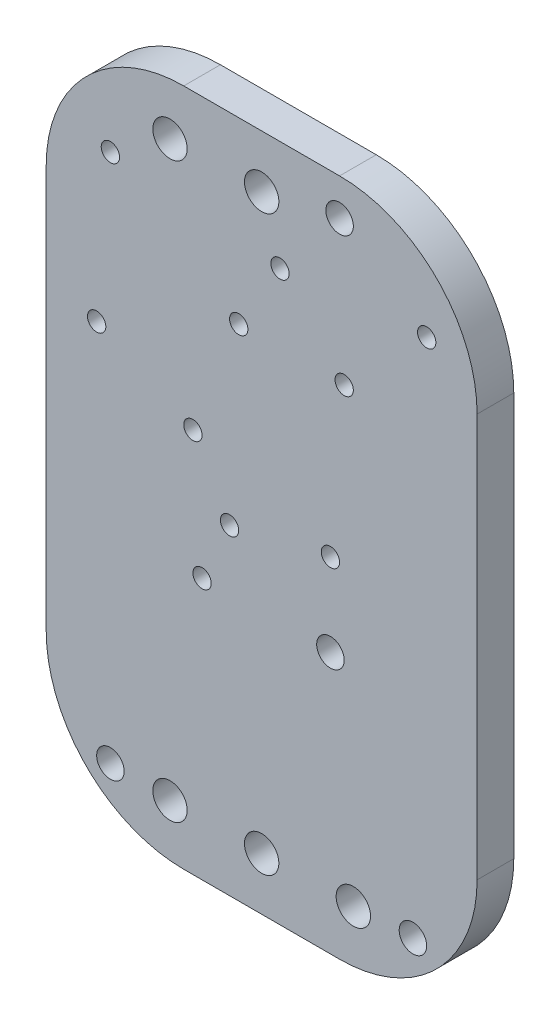
ISO-10303-21;
HEADER;
FILE_DESCRIPTION(('STEP AP214'),'2;1');
FILE_NAME('part.step','',(''),(''),'','','');
FILE_SCHEMA(('AUTOMOTIVE_DESIGN { 1 0 10303 214 1 1 1 1 }'));
ENDSEC;
DATA;
#1=APPLICATION_CONTEXT('core data for automotive mechanical design processes');
#2=APPLICATION_PROTOCOL_DEFINITION('international standard','automotive_design',2000,#1);
#3=PRODUCT_CONTEXT('',#1,'mechanical');
#4=PRODUCT('Part','Part','',(#3));
#5=PRODUCT_RELATED_PRODUCT_CATEGORY('part','',(#4));
#6=PRODUCT_DEFINITION_FORMATION('','',#4);
#7=PRODUCT_DEFINITION_CONTEXT('part definition',#1,'design');
#8=PRODUCT_DEFINITION('design','',#6,#7);
#9=PRODUCT_DEFINITION_SHAPE('','',#8);
#10=(LENGTH_UNIT() NAMED_UNIT(*) SI_UNIT(.MILLI.,.METRE.));
#11=(NAMED_UNIT(*) PLANE_ANGLE_UNIT() SI_UNIT($,.RADIAN.));
#12=(NAMED_UNIT(*) SI_UNIT($,.STERADIAN.) SOLID_ANGLE_UNIT());
#13=UNCERTAINTY_MEASURE_WITH_UNIT(LENGTH_MEASURE(1.E-05),#10,'distance_accuracy_value','');
#14=(GEOMETRIC_REPRESENTATION_CONTEXT(3) GLOBAL_UNCERTAINTY_ASSIGNED_CONTEXT((#13)) GLOBAL_UNIT_ASSIGNED_CONTEXT((#10,
#11,#12)) REPRESENTATION_CONTEXT('',''));
#15=CARTESIAN_POINT('',(0.,0.,0.));
#16=DIRECTION('',(0.,0.,1.));
#17=DIRECTION('',(1.,0.,0.));
#18=AXIS2_PLACEMENT_3D('',#15,#16,#17);
#19=CARTESIAN_POINT('',(3.3,11.9,0.8));
#20=DIRECTION('',(0.,0.,-1.));
#21=DIRECTION('',(-1.,0.,0.));
#22=AXIS2_PLACEMENT_3D('',#19,#20,#21);
#23=CYLINDRICAL_SURFACE('',#22,3.);
#24=CARTESIAN_POINT('',(3.3,11.9,0.));
#25=DIRECTION('',(0.,0.,1.));
#26=DIRECTION('',(1.,0.,0.));
#27=AXIS2_PLACEMENT_3D('',#24,#25,#26);
#28=CIRCLE('',#27,3.);
#29=CARTESIAN_POINT('',(3.3,14.9,0.));
#30=VERTEX_POINT('',#29);
#31=CARTESIAN_POINT('',(0.3,11.9,0.));
#32=VERTEX_POINT('',#31);
#33=EDGE_CURVE('E128',#30,#32,#28,.T.);
#34=ORIENTED_EDGE('',*,*,#33,.T.);
#35=DIRECTION('',(0.,0.,-1.));
#36=VECTOR('',#35,1.);
#37=CARTESIAN_POINT('',(0.3,11.9,0.8));
#38=LINE('',#37,#36);
#39=CARTESIAN_POINT('',(0.3,11.9,0.8));
#40=VERTEX_POINT('',#39);
#41=EDGE_CURVE('E11',#40,#32,#38,.T.);
#42=ORIENTED_EDGE('',*,*,#41,.F.);
#43=CARTESIAN_POINT('',(3.3,11.9,0.8));
#44=DIRECTION('',(0.,0.,1.));
#45=DIRECTION('',(1.,0.,0.));
#46=AXIS2_PLACEMENT_3D('',#43,#44,#45);
#47=CIRCLE('',#46,3.);
#48=CARTESIAN_POINT('',(3.3,14.9,0.8));
#49=VERTEX_POINT('',#48);
#50=EDGE_CURVE('E143',#49,#40,#47,.T.);
#51=ORIENTED_EDGE('',*,*,#50,.F.);
#52=DIRECTION('',(0.,0.,-1.));
#53=VECTOR('',#52,1.);
#54=CARTESIAN_POINT('',(3.3,14.9,0.8));
#55=LINE('',#54,#53);
#56=EDGE_CURVE('E124',#49,#30,#55,.T.);
#57=ORIENTED_EDGE('',*,*,#56,.T.);
#58=EDGE_LOOP('',(#34,#42,#51,#57));
#59=FACE_BOUND('',#58,.T.);
#60=ADVANCED_FACE('F32',(#59),#23,.T.);
#61=CARTESIAN_POINT('',(0.3,11.9,0.8));
#62=DIRECTION('',(1.,0.,0.));
#63=DIRECTION('',(0.,0.,-1.));
#64=AXIS2_PLACEMENT_3D('',#61,#62,#63);
#65=PLANE('',#64);
#66=DIRECTION('',(0.,-1.,0.));
#67=VECTOR('',#66,1.);
#68=CARTESIAN_POINT('',(0.3,11.9,0.));
#69=LINE('',#68,#67);
#70=CARTESIAN_POINT('',(0.3,3.1,0.));
#71=VERTEX_POINT('',#70);
#72=EDGE_CURVE('E131',#32,#71,#69,.T.);
#73=ORIENTED_EDGE('',*,*,#72,.T.);
#74=DIRECTION('',(0.,0.,-1.));
#75=VECTOR('',#74,1.);
#76=CARTESIAN_POINT('',(0.3,3.1,0.8));
#77=LINE('',#76,#75);
#78=CARTESIAN_POINT('',(0.3,3.1,0.8));
#79=VERTEX_POINT('',#78);
#80=EDGE_CURVE('E40',#79,#71,#77,.T.);
#81=ORIENTED_EDGE('',*,*,#80,.F.);
#82=DIRECTION('',(0.,-1.,0.));
#83=VECTOR('',#82,1.);
#84=CARTESIAN_POINT('',(0.3,11.9,0.8));
#85=LINE('',#84,#83);
#86=EDGE_CURVE('E91',#40,#79,#85,.T.);
#87=ORIENTED_EDGE('',*,*,#86,.F.);
#88=ORIENTED_EDGE('',*,*,#41,.T.);
#89=EDGE_LOOP('',(#73,#81,#87,#88));
#90=FACE_BOUND('',#89,.T.);
#91=ADVANCED_FACE('F345',(#90),#65,.F.);
#92=CARTESIAN_POINT('',(3.3,3.1,0.8));
#93=DIRECTION('',(0.,0.,-1.));
#94=DIRECTION('',(-1.,0.,0.));
#95=AXIS2_PLACEMENT_3D('',#92,#93,#94);
#96=CYLINDRICAL_SURFACE('',#95,3.);
#97=CARTESIAN_POINT('',(3.3,3.1,0.));
#98=DIRECTION('',(0.,0.,1.));
#99=DIRECTION('',(1.,0.,0.));
#100=AXIS2_PLACEMENT_3D('',#97,#98,#99);
#101=CIRCLE('',#100,3.);
#102=CARTESIAN_POINT('',(3.3,0.1,0.));
#103=VERTEX_POINT('',#102);
#104=EDGE_CURVE('E134',#71,#103,#101,.T.);
#105=ORIENTED_EDGE('',*,*,#104,.T.);
#106=DIRECTION('',(0.,0.,-1.));
#107=VECTOR('',#106,1.);
#108=CARTESIAN_POINT('',(3.3,0.1,0.8));
#109=LINE('',#108,#107);
#110=CARTESIAN_POINT('',(3.3,0.1,0.8));
#111=VERTEX_POINT('',#110);
#112=EDGE_CURVE('E150',#111,#103,#109,.T.);
#113=ORIENTED_EDGE('',*,*,#112,.F.);
#114=CARTESIAN_POINT('',(3.3,3.1,0.8));
#115=DIRECTION('',(0.,0.,1.));
#116=DIRECTION('',(1.,0.,0.));
#117=AXIS2_PLACEMENT_3D('',#114,#115,#116);
#118=CIRCLE('',#117,3.);
#119=EDGE_CURVE('E158',#79,#111,#118,.T.);
#120=ORIENTED_EDGE('',*,*,#119,.F.);
#121=ORIENTED_EDGE('',*,*,#80,.T.);
#122=EDGE_LOOP('',(#105,#113,#120,#121));
#123=FACE_BOUND('',#122,.T.);
#124=ADVANCED_FACE('F156',(#123),#96,.T.);
#125=CARTESIAN_POINT('',(3.3,0.1,0.8));
#126=DIRECTION('',(0.,1.,0.));
#127=DIRECTION('',(0.,0.,1.));
#128=AXIS2_PLACEMENT_3D('',#125,#126,#127);
#129=PLANE('',#128);
#130=DIRECTION('',(1.,0.,0.));
#131=VECTOR('',#130,1.);
#132=CARTESIAN_POINT('',(3.3,0.1,0.));
#133=LINE('',#132,#131);
#134=CARTESIAN_POINT('',(6.7,0.1,0.));
#135=VERTEX_POINT('',#134);
#136=EDGE_CURVE('E136',#103,#135,#133,.T.);
#137=ORIENTED_EDGE('',*,*,#136,.T.);
#138=DIRECTION('',(0.,0.,-1.));
#139=VECTOR('',#138,1.);
#140=CARTESIAN_POINT('',(6.7,0.1,0.8));
#141=LINE('',#140,#139);
#142=CARTESIAN_POINT('',(6.7,0.1,0.8));
#143=VERTEX_POINT('',#142);
#144=EDGE_CURVE('E147',#143,#135,#141,.T.);
#145=ORIENTED_EDGE('',*,*,#144,.F.);
#146=DIRECTION('',(1.,0.,0.));
#147=VECTOR('',#146,1.);
#148=CARTESIAN_POINT('',(3.3,0.1,0.8));
#149=LINE('',#148,#147);
#150=EDGE_CURVE('E170',#111,#143,#149,.T.);
#151=ORIENTED_EDGE('',*,*,#150,.F.);
#152=ORIENTED_EDGE('',*,*,#112,.T.);
#153=EDGE_LOOP('',(#137,#145,#151,#152));
#154=FACE_BOUND('',#153,.T.);
#155=ADVANCED_FACE('F166',(#154),#129,.F.);
#156=CARTESIAN_POINT('',(6.7,3.1,0.8));
#157=DIRECTION('',(0.,0.,-1.));
#158=DIRECTION('',(-1.,0.,0.));
#159=AXIS2_PLACEMENT_3D('',#156,#157,#158);
#160=CYLINDRICAL_SURFACE('',#159,3.);
#161=CARTESIAN_POINT('',(6.7,3.1,0.));
#162=DIRECTION('',(0.,0.,1.));
#163=DIRECTION('',(1.,0.,0.));
#164=AXIS2_PLACEMENT_3D('',#161,#162,#163);
#165=CIRCLE('',#164,3.);
#166=CARTESIAN_POINT('',(9.7,3.1,0.));
#167=VERTEX_POINT('',#166);
#168=EDGE_CURVE('E138',#135,#167,#165,.T.);
#169=ORIENTED_EDGE('',*,*,#168,.T.);
#170=DIRECTION('',(0.,0.,-1.));
#171=VECTOR('',#170,1.);
#172=CARTESIAN_POINT('',(9.7,3.1,0.8));
#173=LINE('',#172,#171);
#174=CARTESIAN_POINT('',(9.7,3.1,0.8));
#175=VERTEX_POINT('',#174);
#176=EDGE_CURVE('E119',#175,#167,#173,.T.);
#177=ORIENTED_EDGE('',*,*,#176,.F.);
#178=CARTESIAN_POINT('',(6.7,3.1,0.8));
#179=DIRECTION('',(0.,0.,1.));
#180=DIRECTION('',(1.,0.,0.));
#181=AXIS2_PLACEMENT_3D('',#178,#179,#180);
#182=CIRCLE('',#181,3.);
#183=EDGE_CURVE('E110',#143,#175,#182,.T.);
#184=ORIENTED_EDGE('',*,*,#183,.F.);
#185=ORIENTED_EDGE('',*,*,#144,.T.);
#186=EDGE_LOOP('',(#169,#177,#184,#185));
#187=FACE_BOUND('',#186,.T.);
#188=ADVANCED_FACE('F169',(#187),#160,.T.);
#189=CARTESIAN_POINT('',(9.7,3.1,0.8));
#190=DIRECTION('',(-1.,0.,0.));
#191=DIRECTION('',(0.,0.,1.));
#192=AXIS2_PLACEMENT_3D('',#189,#190,#191);
#193=PLANE('',#192);
#194=DIRECTION('',(0.,1.,0.));
#195=VECTOR('',#194,1.);
#196=CARTESIAN_POINT('',(9.7,3.1,0.));
#197=LINE('',#196,#195);
#198=CARTESIAN_POINT('',(9.7,11.9,0.));
#199=VERTEX_POINT('',#198);
#200=EDGE_CURVE('E118',#167,#199,#197,.T.);
#201=ORIENTED_EDGE('',*,*,#200,.T.);
#202=DIRECTION('',(0.,0.,-1.));
#203=VECTOR('',#202,1.);
#204=CARTESIAN_POINT('',(9.7,11.9,0.8));
#205=LINE('',#204,#203);
#206=CARTESIAN_POINT('',(9.7,11.9,0.8));
#207=VERTEX_POINT('',#206);
#208=EDGE_CURVE('E115',#207,#199,#205,.T.);
#209=ORIENTED_EDGE('',*,*,#208,.F.);
#210=DIRECTION('',(0.,1.,0.));
#211=VECTOR('',#210,1.);
#212=CARTESIAN_POINT('',(9.7,3.1,0.8));
#213=LINE('',#212,#211);
#214=EDGE_CURVE('E104',#175,#207,#213,.T.);
#215=ORIENTED_EDGE('',*,*,#214,.F.);
#216=ORIENTED_EDGE('',*,*,#176,.T.);
#217=EDGE_LOOP('',(#201,#209,#215,#216));
#218=FACE_BOUND('',#217,.T.);
#219=ADVANCED_FACE('F116',(#218),#193,.F.);
#220=CARTESIAN_POINT('',(6.7,11.9,0.8));
#221=DIRECTION('',(0.,0.,-1.));
#222=DIRECTION('',(-1.,0.,0.));
#223=AXIS2_PLACEMENT_3D('',#220,#221,#222);
#224=CYLINDRICAL_SURFACE('',#223,3.);
#225=CARTESIAN_POINT('',(6.7,11.9,0.));
#226=DIRECTION('',(0.,0.,1.));
#227=DIRECTION('',(1.,0.,0.));
#228=AXIS2_PLACEMENT_3D('',#225,#226,#227);
#229=CIRCLE('',#228,3.);
#230=CARTESIAN_POINT('',(6.7,14.9,0.));
#231=VERTEX_POINT('',#230);
#232=EDGE_CURVE('E77',#199,#231,#229,.T.);
#233=ORIENTED_EDGE('',*,*,#232,.T.);
#234=DIRECTION('',(0.,0.,-1.));
#235=VECTOR('',#234,1.);
#236=CARTESIAN_POINT('',(6.7,14.9,0.8));
#237=LINE('',#236,#235);
#238=CARTESIAN_POINT('',(6.7,14.9,0.8));
#239=VERTEX_POINT('',#238);
#240=EDGE_CURVE('E120',#239,#231,#237,.T.);
#241=ORIENTED_EDGE('',*,*,#240,.F.);
#242=CARTESIAN_POINT('',(6.7,11.9,0.8));
#243=DIRECTION('',(0.,0.,1.));
#244=DIRECTION('',(1.,0.,0.));
#245=AXIS2_PLACEMENT_3D('',#242,#243,#244);
#246=CIRCLE('',#245,3.);
#247=EDGE_CURVE('E108',#207,#239,#246,.T.);
#248=ORIENTED_EDGE('',*,*,#247,.F.);
#249=ORIENTED_EDGE('',*,*,#208,.T.);
#250=EDGE_LOOP('',(#233,#241,#248,#249));
#251=FACE_BOUND('',#250,.T.);
#252=ADVANCED_FACE('F122',(#251),#224,.T.);
#253=CARTESIAN_POINT('',(6.7,14.9,0.8));
#254=DIRECTION('',(0.,-1.,0.));
#255=DIRECTION('',(0.,0.,-1.));
#256=AXIS2_PLACEMENT_3D('',#253,#254,#255);
#257=PLANE('',#256);
#258=DIRECTION('',(-1.,0.,0.));
#259=VECTOR('',#258,1.);
#260=CARTESIAN_POINT('',(6.7,14.9,0.));
#261=LINE('',#260,#259);
#262=EDGE_CURVE('E83',#231,#30,#261,.T.);
#263=ORIENTED_EDGE('',*,*,#262,.T.);
#264=ORIENTED_EDGE('',*,*,#56,.F.);
#265=DIRECTION('',(-1.,0.,0.));
#266=VECTOR('',#265,1.);
#267=CARTESIAN_POINT('',(6.7,14.9,0.8));
#268=LINE('',#267,#266);
#269=EDGE_CURVE('E48',#239,#49,#268,.T.);
#270=ORIENTED_EDGE('',*,*,#269,.F.);
#271=ORIENTED_EDGE('',*,*,#240,.T.);
#272=EDGE_LOOP('',(#263,#264,#270,#271));
#273=FACE_BOUND('',#272,.T.);
#274=ADVANCED_FACE('F295',(#273),#257,.F.);
#275=CARTESIAN_POINT('',(3.3,11.9,0.8));
#276=DIRECTION('',(0.,0.,1.));
#277=DIRECTION('',(1.,0.,0.));
#278=AXIS2_PLACEMENT_3D('',#275,#276,#277);
#279=PLANE('',#278);
#280=CARTESIAN_POINT('',(6.8,11.,0.8));
#281=DIRECTION('',(0.,0.,1.));
#282=DIRECTION('',(1.,0.,0.));
#283=AXIS2_PLACEMENT_3D('',#280,#281,#282);
#284=CIRCLE('',#283,0.2);
#285=CARTESIAN_POINT('',(7.,11.,0.8));
#286=VERTEX_POINT('',#285);
#287=EDGE_CURVE('E246',#286,#286,#284,.T.);
#288=ORIENTED_EDGE('',*,*,#287,.F.);
#289=EDGE_LOOP('',(#288));
#290=FACE_BOUND('',#289,.T.);
#291=CARTESIAN_POINT('',(6.5,7.6,0.8));
#292=DIRECTION('',(0.,0.,1.));
#293=DIRECTION('',(1.,0.,0.));
#294=AXIS2_PLACEMENT_3D('',#291,#292,#293);
#295=CIRCLE('',#294,0.2);
#296=CARTESIAN_POINT('',(6.7,7.6,0.8));
#297=VERTEX_POINT('',#296);
#298=EDGE_CURVE('E263',#297,#297,#295,.T.);
#299=ORIENTED_EDGE('',*,*,#298,.F.);
#300=EDGE_LOOP('',(#299));
#301=FACE_BOUND('',#300,.T.);
#302=CARTESIAN_POINT('',(6.5,5.8,0.8));
#303=DIRECTION('',(0.,0.,1.));
#304=DIRECTION('',(1.,0.,0.));
#305=AXIS2_PLACEMENT_3D('',#302,#303,#304);
#306=CIRCLE('',#305,0.3);
#307=CARTESIAN_POINT('',(6.8,5.8,0.8));
#308=VERTEX_POINT('',#307);
#309=EDGE_CURVE('E264',#308,#308,#306,.T.);
#310=ORIENTED_EDGE('',*,*,#309,.F.);
#311=EDGE_LOOP('',(#310));
#312=FACE_BOUND('',#311,.T.);
#313=CARTESIAN_POINT('',(4.3,7.1,0.8));
#314=DIRECTION('',(0.,0.,1.));
#315=DIRECTION('',(1.,0.,0.));
#316=AXIS2_PLACEMENT_3D('',#313,#314,#315);
#317=CIRCLE('',#316,0.2);
#318=CARTESIAN_POINT('',(4.5,7.1,0.8));
#319=VERTEX_POINT('',#318);
#320=EDGE_CURVE('E281',#319,#319,#317,.T.);
#321=ORIENTED_EDGE('',*,*,#320,.F.);
#322=EDGE_LOOP('',(#321));
#323=FACE_BOUND('',#322,.T.);
#324=CARTESIAN_POINT('',(5.4,12.5,0.8));
#325=DIRECTION('',(0.,0.,1.));
#326=DIRECTION('',(1.,0.,0.));
#327=AXIS2_PLACEMENT_3D('',#324,#325,#326);
#328=CIRCLE('',#327,0.2);
#329=CARTESIAN_POINT('',(5.6,12.5,0.8));
#330=VERTEX_POINT('',#329);
#331=EDGE_CURVE('E275',#330,#330,#328,.T.);
#332=ORIENTED_EDGE('',*,*,#331,.F.);
#333=EDGE_LOOP('',(#332));
#334=FACE_BOUND('',#333,.T.);
#335=CARTESIAN_POINT('',(1.4,9.5,0.8));
#336=DIRECTION('',(0.,0.,1.));
#337=DIRECTION('',(1.,0.,0.));
#338=AXIS2_PLACEMENT_3D('',#335,#336,#337);
#339=CIRCLE('',#338,0.2);
#340=CARTESIAN_POINT('',(1.6,9.5,0.8));
#341=VERTEX_POINT('',#340);
#342=EDGE_CURVE('E227',#341,#341,#339,.T.);
#343=ORIENTED_EDGE('',*,*,#342,.F.);
#344=EDGE_LOOP('',(#343));
#345=FACE_BOUND('',#344,.T.);
#346=CARTESIAN_POINT('',(8.6,12.8,0.8));
#347=DIRECTION('',(0.,0.,1.));
#348=DIRECTION('',(1.,0.,0.));
#349=AXIS2_PLACEMENT_3D('',#346,#347,#348);
#350=CIRCLE('',#349,0.200000000000001);
#351=CARTESIAN_POINT('',(8.8,12.8,0.8));
#352=VERTEX_POINT('',#351);
#353=EDGE_CURVE('E233',#352,#352,#350,.T.);
#354=ORIENTED_EDGE('',*,*,#353,.F.);
#355=EDGE_LOOP('',(#354));
#356=FACE_BOUND('',#355,.T.);
#357=CARTESIAN_POINT('',(1.7,12.85,0.8));
#358=DIRECTION('',(0.,0.,1.));
#359=DIRECTION('',(1.,0.,0.));
#360=AXIS2_PLACEMENT_3D('',#357,#358,#359);
#361=CIRCLE('',#360,0.2);
#362=CARTESIAN_POINT('',(1.9,12.85,0.8));
#363=VERTEX_POINT('',#362);
#364=EDGE_CURVE('E234',#363,#363,#361,.T.);
#365=ORIENTED_EDGE('',*,*,#364,.F.);
#366=EDGE_LOOP('',(#365));
#367=FACE_BOUND('',#366,.T.);
#368=CARTESIAN_POINT('',(3.5,8.5,0.8));
#369=DIRECTION('',(0.,0.,1.));
#370=DIRECTION('',(1.,0.,0.));
#371=AXIS2_PLACEMENT_3D('',#368,#369,#370);
#372=CIRCLE('',#371,0.2);
#373=CARTESIAN_POINT('',(3.7,8.5,0.8));
#374=VERTEX_POINT('',#373);
#375=EDGE_CURVE('E252',#374,#374,#372,.T.);
#376=ORIENTED_EDGE('',*,*,#375,.F.);
#377=EDGE_LOOP('',(#376));
#378=FACE_BOUND('',#377,.T.);
#379=CARTESIAN_POINT('',(3.7,5.8,0.8));
#380=DIRECTION('',(0.,0.,1.));
#381=DIRECTION('',(1.,0.,0.));
#382=AXIS2_PLACEMENT_3D('',#379,#380,#381);
#383=CIRCLE('',#382,0.2);
#384=CARTESIAN_POINT('',(3.9,5.8,0.8));
#385=VERTEX_POINT('',#384);
#386=EDGE_CURVE('E245',#385,#385,#383,.T.);
#387=ORIENTED_EDGE('',*,*,#386,.F.);
#388=EDGE_LOOP('',(#387));
#389=FACE_BOUND('',#388,.T.);
#390=CARTESIAN_POINT('',(4.5,11.,0.8));
#391=DIRECTION('',(0.,0.,1.));
#392=DIRECTION('',(1.,0.,0.));
#393=AXIS2_PLACEMENT_3D('',#390,#391,#392);
#394=CIRCLE('',#393,0.2);
#395=CARTESIAN_POINT('',(4.7,11.,0.8));
#396=VERTEX_POINT('',#395);
#397=EDGE_CURVE('E204',#396,#396,#394,.T.);
#398=ORIENTED_EDGE('',*,*,#397,.F.);
#399=EDGE_LOOP('',(#398));
#400=FACE_BOUND('',#399,.T.);
#401=CARTESIAN_POINT('',(7.,1.25,0.8));
#402=DIRECTION('',(0.,0.,1.));
#403=DIRECTION('',(1.,0.,0.));
#404=AXIS2_PLACEMENT_3D('',#401,#402,#403);
#405=CIRCLE('',#404,0.375);
#406=CARTESIAN_POINT('',(7.375,1.25,0.8));
#407=VERTEX_POINT('',#406);
#408=EDGE_CURVE('E203',#407,#407,#405,.T.);
#409=ORIENTED_EDGE('',*,*,#408,.F.);
#410=EDGE_LOOP('',(#409));
#411=FACE_BOUND('',#410,.T.);
#412=CARTESIAN_POINT('',(5.,1.25,0.8));
#413=DIRECTION('',(0.,0.,1.));
#414=DIRECTION('',(1.,0.,0.));
#415=AXIS2_PLACEMENT_3D('',#412,#413,#414);
#416=CIRCLE('',#415,0.375);
#417=CARTESIAN_POINT('',(5.375,1.25,0.8));
#418=VERTEX_POINT('',#417);
#419=EDGE_CURVE('E210',#418,#418,#416,.T.);
#420=ORIENTED_EDGE('',*,*,#419,.F.);
#421=EDGE_LOOP('',(#420));
#422=FACE_BOUND('',#421,.T.);
#423=CARTESIAN_POINT('',(3.,1.25,0.8));
#424=DIRECTION('',(0.,0.,1.));
#425=DIRECTION('',(1.,0.,0.));
#426=AXIS2_PLACEMENT_3D('',#423,#424,#425);
#427=CIRCLE('',#426,0.375);
#428=CARTESIAN_POINT('',(3.375,1.25,0.8));
#429=VERTEX_POINT('',#428);
#430=EDGE_CURVE('E216',#429,#429,#427,.T.);
#431=ORIENTED_EDGE('',*,*,#430,.F.);
#432=EDGE_LOOP('',(#431));
#433=FACE_BOUND('',#432,.T.);
#434=CARTESIAN_POINT('',(3.,13.75,0.8));
#435=DIRECTION('',(0.,0.,1.));
#436=DIRECTION('',(1.,0.,0.));
#437=AXIS2_PLACEMENT_3D('',#434,#435,#436);
#438=CIRCLE('',#437,0.375);
#439=CARTESIAN_POINT('',(3.375,13.75,0.8));
#440=VERTEX_POINT('',#439);
#441=EDGE_CURVE('E186',#440,#440,#438,.T.);
#442=ORIENTED_EDGE('',*,*,#441,.F.);
#443=EDGE_LOOP('',(#442));
#444=FACE_BOUND('',#443,.T.);
#445=CARTESIAN_POINT('',(5.,13.75,0.8));
#446=DIRECTION('',(0.,0.,1.));
#447=DIRECTION('',(1.,0.,0.));
#448=AXIS2_PLACEMENT_3D('',#445,#446,#447);
#449=CIRCLE('',#448,0.375);
#450=CARTESIAN_POINT('',(5.375,13.75,0.8));
#451=VERTEX_POINT('',#450);
#452=EDGE_CURVE('E185',#451,#451,#449,.T.);
#453=ORIENTED_EDGE('',*,*,#452,.F.);
#454=EDGE_LOOP('',(#453));
#455=FACE_BOUND('',#454,.T.);
#456=CARTESIAN_POINT('',(6.7,14.1,0.8));
#457=DIRECTION('',(0.,0.,1.));
#458=DIRECTION('',(1.,0.,0.));
#459=AXIS2_PLACEMENT_3D('',#456,#457,#458);
#460=CIRCLE('',#459,0.3);
#461=CARTESIAN_POINT('',(7.,14.1,0.8));
#462=VERTEX_POINT('',#461);
#463=EDGE_CURVE('E192',#462,#462,#460,.T.);
#464=ORIENTED_EDGE('',*,*,#463,.F.);
#465=EDGE_LOOP('',(#464));
#466=FACE_BOUND('',#465,.T.);
#467=CARTESIAN_POINT('',(8.3,1.3,0.8));
#468=DIRECTION('',(0.,0.,1.));
#469=DIRECTION('',(1.,0.,0.));
#470=AXIS2_PLACEMENT_3D('',#467,#468,#469);
#471=CIRCLE('',#470,0.3);
#472=CARTESIAN_POINT('',(8.6,1.3,0.8));
#473=VERTEX_POINT('',#472);
#474=EDGE_CURVE('E179',#473,#473,#471,.T.);
#475=ORIENTED_EDGE('',*,*,#474,.F.);
#476=EDGE_LOOP('',(#475));
#477=FACE_BOUND('',#476,.T.);
#478=CARTESIAN_POINT('',(1.7,1.3,0.8));
#479=DIRECTION('',(0.,0.,1.));
#480=DIRECTION('',(1.,0.,0.));
#481=AXIS2_PLACEMENT_3D('',#478,#479,#480);
#482=CIRCLE('',#481,0.3);
#483=CARTESIAN_POINT('',(2.,1.3,0.8));
#484=VERTEX_POINT('',#483);
#485=EDGE_CURVE('E132',#484,#484,#482,.T.);
#486=ORIENTED_EDGE('',*,*,#485,.F.);
#487=EDGE_LOOP('',(#486));
#488=FACE_BOUND('',#487,.T.);
#489=ORIENTED_EDGE('',*,*,#50,.T.);
#490=ORIENTED_EDGE('',*,*,#86,.T.);
#491=ORIENTED_EDGE('',*,*,#119,.T.);
#492=ORIENTED_EDGE('',*,*,#150,.T.);
#493=ORIENTED_EDGE('',*,*,#183,.T.);
#494=ORIENTED_EDGE('',*,*,#214,.T.);
#495=ORIENTED_EDGE('',*,*,#247,.T.);
#496=ORIENTED_EDGE('',*,*,#269,.T.);
#497=EDGE_LOOP('',(#489,#490,#491,#492,#493,#494,#495,#496));
#498=FACE_BOUND('',#497,.T.);
#499=ADVANCED_FACE('F106',(#290,#301,#312,#323,#334,#345,#356,#367,#378,#389,#400,#411,#422,
#433,#444,#455,#466,#477,#488,#498),#279,.T.);
#500=CARTESIAN_POINT('',(3.3,11.9,0.));
#501=DIRECTION('',(0.,0.,1.));
#502=DIRECTION('',(1.,0.,0.));
#503=AXIS2_PLACEMENT_3D('',#500,#501,#502);
#504=PLANE('',#503);
#505=CARTESIAN_POINT('',(6.8,11.,0.));
#506=DIRECTION('',(0.,0.,1.));
#507=DIRECTION('',(1.,0.,0.));
#508=AXIS2_PLACEMENT_3D('',#505,#506,#507);
#509=CIRCLE('',#508,0.2);
#510=CARTESIAN_POINT('',(7.,11.,0.));
#511=VERTEX_POINT('',#510);
#512=EDGE_CURVE('E267',#511,#511,#509,.T.);
#513=ORIENTED_EDGE('',*,*,#512,.T.);
#514=EDGE_LOOP('',(#513));
#515=FACE_BOUND('',#514,.T.);
#516=CARTESIAN_POINT('',(6.5,7.6,0.));
#517=DIRECTION('',(0.,0.,1.));
#518=DIRECTION('',(1.,0.,0.));
#519=AXIS2_PLACEMENT_3D('',#516,#517,#518);
#520=CIRCLE('',#519,0.2);
#521=CARTESIAN_POINT('',(6.7,7.6,0.));
#522=VERTEX_POINT('',#521);
#523=EDGE_CURVE('E260',#522,#522,#520,.T.);
#524=ORIENTED_EDGE('',*,*,#523,.T.);
#525=EDGE_LOOP('',(#524));
#526=FACE_BOUND('',#525,.T.);
#527=CARTESIAN_POINT('',(6.5,5.8,0.));
#528=DIRECTION('',(0.,0.,1.));
#529=DIRECTION('',(1.,0.,0.));
#530=AXIS2_PLACEMENT_3D('',#527,#528,#529);
#531=CIRCLE('',#530,0.3);
#532=CARTESIAN_POINT('',(6.8,5.8,0.));
#533=VERTEX_POINT('',#532);
#534=EDGE_CURVE('E284',#533,#533,#531,.T.);
#535=ORIENTED_EDGE('',*,*,#534,.T.);
#536=EDGE_LOOP('',(#535));
#537=FACE_BOUND('',#536,.T.);
#538=CARTESIAN_POINT('',(4.3,7.1,0.));
#539=DIRECTION('',(0.,0.,1.));
#540=DIRECTION('',(1.,0.,0.));
#541=AXIS2_PLACEMENT_3D('',#538,#539,#540);
#542=CIRCLE('',#541,0.2);
#543=CARTESIAN_POINT('',(4.5,7.1,0.));
#544=VERTEX_POINT('',#543);
#545=EDGE_CURVE('E278',#544,#544,#542,.T.);
#546=ORIENTED_EDGE('',*,*,#545,.T.);
#547=EDGE_LOOP('',(#546));
#548=FACE_BOUND('',#547,.T.);
#549=CARTESIAN_POINT('',(5.4,12.5,0.));
#550=DIRECTION('',(0.,0.,1.));
#551=DIRECTION('',(1.,0.,0.));
#552=AXIS2_PLACEMENT_3D('',#549,#550,#551);
#553=CIRCLE('',#552,0.2);
#554=CARTESIAN_POINT('',(5.6,12.5,0.));
#555=VERTEX_POINT('',#554);
#556=EDGE_CURVE('E272',#555,#555,#553,.T.);
#557=ORIENTED_EDGE('',*,*,#556,.T.);
#558=EDGE_LOOP('',(#557));
#559=FACE_BOUND('',#558,.T.);
#560=CARTESIAN_POINT('',(1.4,9.5,0.));
#561=DIRECTION('',(0.,0.,1.));
#562=DIRECTION('',(1.,0.,0.));
#563=AXIS2_PLACEMENT_3D('',#560,#561,#562);
#564=CIRCLE('',#563,0.2);
#565=CARTESIAN_POINT('',(1.6,9.5,0.));
#566=VERTEX_POINT('',#565);
#567=EDGE_CURVE('E237',#566,#566,#564,.T.);
#568=ORIENTED_EDGE('',*,*,#567,.T.);
#569=EDGE_LOOP('',(#568));
#570=FACE_BOUND('',#569,.T.);
#571=CARTESIAN_POINT('',(8.6,12.8,0.));
#572=DIRECTION('',(0.,0.,1.));
#573=DIRECTION('',(1.,0.,0.));
#574=AXIS2_PLACEMENT_3D('',#571,#572,#573);
#575=CIRCLE('',#574,0.200000000000001);
#576=CARTESIAN_POINT('',(8.8,12.8,0.));
#577=VERTEX_POINT('',#576);
#578=EDGE_CURVE('E230',#577,#577,#575,.T.);
#579=ORIENTED_EDGE('',*,*,#578,.T.);
#580=EDGE_LOOP('',(#579));
#581=FACE_BOUND('',#580,.T.);
#582=CARTESIAN_POINT('',(1.7,12.85,0.));
#583=DIRECTION('',(0.,0.,1.));
#584=DIRECTION('',(1.,0.,0.));
#585=AXIS2_PLACEMENT_3D('',#582,#583,#584);
#586=CIRCLE('',#585,0.2);
#587=CARTESIAN_POINT('',(1.9,12.85,0.));
#588=VERTEX_POINT('',#587);
#589=EDGE_CURVE('E255',#588,#588,#586,.T.);
#590=ORIENTED_EDGE('',*,*,#589,.T.);
#591=EDGE_LOOP('',(#590));
#592=FACE_BOUND('',#591,.T.);
#593=CARTESIAN_POINT('',(3.5,8.5,0.));
#594=DIRECTION('',(0.,0.,1.));
#595=DIRECTION('',(1.,0.,0.));
#596=AXIS2_PLACEMENT_3D('',#593,#594,#595);
#597=CIRCLE('',#596,0.2);
#598=CARTESIAN_POINT('',(3.7,8.5,0.));
#599=VERTEX_POINT('',#598);
#600=EDGE_CURVE('E249',#599,#599,#597,.T.);
#601=ORIENTED_EDGE('',*,*,#600,.T.);
#602=EDGE_LOOP('',(#601));
#603=FACE_BOUND('',#602,.T.);
#604=CARTESIAN_POINT('',(3.7,5.8,0.));
#605=DIRECTION('',(0.,0.,1.));
#606=DIRECTION('',(1.,0.,0.));
#607=AXIS2_PLACEMENT_3D('',#604,#605,#606);
#608=CIRCLE('',#607,0.2);
#609=CARTESIAN_POINT('',(3.9,5.8,0.));
#610=VERTEX_POINT('',#609);
#611=EDGE_CURVE('E242',#610,#610,#608,.T.);
#612=ORIENTED_EDGE('',*,*,#611,.T.);
#613=EDGE_LOOP('',(#612));
#614=FACE_BOUND('',#613,.T.);
#615=CARTESIAN_POINT('',(4.5,11.,0.));
#616=DIRECTION('',(0.,0.,1.));
#617=DIRECTION('',(1.,0.,0.));
#618=AXIS2_PLACEMENT_3D('',#615,#616,#617);
#619=CIRCLE('',#618,0.2);
#620=CARTESIAN_POINT('',(4.7,11.,0.));
#621=VERTEX_POINT('',#620);
#622=EDGE_CURVE('E224',#621,#621,#619,.T.);
#623=ORIENTED_EDGE('',*,*,#622,.T.);
#624=EDGE_LOOP('',(#623));
#625=FACE_BOUND('',#624,.T.);
#626=CARTESIAN_POINT('',(7.,1.25,0.));
#627=DIRECTION('',(0.,0.,1.));
#628=DIRECTION('',(1.,0.,0.));
#629=AXIS2_PLACEMENT_3D('',#626,#627,#628);
#630=CIRCLE('',#629,0.375);
#631=CARTESIAN_POINT('',(7.375,1.25,0.));
#632=VERTEX_POINT('',#631);
#633=EDGE_CURVE('E200',#632,#632,#630,.T.);
#634=ORIENTED_EDGE('',*,*,#633,.T.);
#635=EDGE_LOOP('',(#634));
#636=FACE_BOUND('',#635,.T.);
#637=CARTESIAN_POINT('',(5.,1.25,0.));
#638=DIRECTION('',(0.,0.,1.));
#639=DIRECTION('',(1.,0.,0.));
#640=AXIS2_PLACEMENT_3D('',#637,#638,#639);
#641=CIRCLE('',#640,0.375);
#642=CARTESIAN_POINT('',(5.375,1.25,0.));
#643=VERTEX_POINT('',#642);
#644=EDGE_CURVE('E207',#643,#643,#641,.T.);
#645=ORIENTED_EDGE('',*,*,#644,.T.);
#646=EDGE_LOOP('',(#645));
#647=FACE_BOUND('',#646,.T.);
#648=CARTESIAN_POINT('',(3.,1.25,0.));
#649=DIRECTION('',(0.,0.,1.));
#650=DIRECTION('',(1.,0.,0.));
#651=AXIS2_PLACEMENT_3D('',#648,#649,#650);
#652=CIRCLE('',#651,0.375);
#653=CARTESIAN_POINT('',(3.375,1.25,0.));
#654=VERTEX_POINT('',#653);
#655=EDGE_CURVE('E213',#654,#654,#652,.T.);
#656=ORIENTED_EDGE('',*,*,#655,.T.);
#657=EDGE_LOOP('',(#656));
#658=FACE_BOUND('',#657,.T.);
#659=CARTESIAN_POINT('',(3.,13.75,0.));
#660=DIRECTION('',(0.,0.,1.));
#661=DIRECTION('',(1.,0.,0.));
#662=AXIS2_PLACEMENT_3D('',#659,#660,#661);
#663=CIRCLE('',#662,0.375);
#664=CARTESIAN_POINT('',(3.375,13.75,0.));
#665=VERTEX_POINT('',#664);
#666=EDGE_CURVE('E219',#665,#665,#663,.T.);
#667=ORIENTED_EDGE('',*,*,#666,.T.);
#668=EDGE_LOOP('',(#667));
#669=FACE_BOUND('',#668,.T.);
#670=CARTESIAN_POINT('',(5.,13.75,0.));
#671=DIRECTION('',(0.,0.,1.));
#672=DIRECTION('',(1.,0.,0.));
#673=AXIS2_PLACEMENT_3D('',#670,#671,#672);
#674=CIRCLE('',#673,0.375);
#675=CARTESIAN_POINT('',(5.375,13.75,0.));
#676=VERTEX_POINT('',#675);
#677=EDGE_CURVE('E182',#676,#676,#674,.T.);
#678=ORIENTED_EDGE('',*,*,#677,.T.);
#679=EDGE_LOOP('',(#678));
#680=FACE_BOUND('',#679,.T.);
#681=CARTESIAN_POINT('',(6.7,14.1,0.));
#682=DIRECTION('',(0.,0.,1.));
#683=DIRECTION('',(1.,0.,0.));
#684=AXIS2_PLACEMENT_3D('',#681,#682,#683);
#685=CIRCLE('',#684,0.3);
#686=CARTESIAN_POINT('',(7.,14.1,0.));
#687=VERTEX_POINT('',#686);
#688=EDGE_CURVE('E189',#687,#687,#685,.T.);
#689=ORIENTED_EDGE('',*,*,#688,.T.);
#690=EDGE_LOOP('',(#689));
#691=FACE_BOUND('',#690,.T.);
#692=CARTESIAN_POINT('',(8.3,1.3,0.));
#693=DIRECTION('',(0.,0.,1.));
#694=DIRECTION('',(1.,0.,0.));
#695=AXIS2_PLACEMENT_3D('',#692,#693,#694);
#696=CIRCLE('',#695,0.3);
#697=CARTESIAN_POINT('',(8.6,1.3,0.));
#698=VERTEX_POINT('',#697);
#699=EDGE_CURVE('E195',#698,#698,#696,.T.);
#700=ORIENTED_EDGE('',*,*,#699,.T.);
#701=EDGE_LOOP('',(#700));
#702=FACE_BOUND('',#701,.T.);
#703=CARTESIAN_POINT('',(1.7,1.3,0.));
#704=DIRECTION('',(0.,0.,1.));
#705=DIRECTION('',(1.,0.,0.));
#706=AXIS2_PLACEMENT_3D('',#703,#704,#705);
#707=CIRCLE('',#706,0.3);
#708=CARTESIAN_POINT('',(2.,1.3,0.));
#709=VERTEX_POINT('',#708);
#710=EDGE_CURVE('E176',#709,#709,#707,.T.);
#711=ORIENTED_EDGE('',*,*,#710,.T.);
#712=EDGE_LOOP('',(#711));
#713=FACE_BOUND('',#712,.T.);
#714=ORIENTED_EDGE('',*,*,#33,.F.);
#715=ORIENTED_EDGE('',*,*,#262,.F.);
#716=ORIENTED_EDGE('',*,*,#232,.F.);
#717=ORIENTED_EDGE('',*,*,#200,.F.);
#718=ORIENTED_EDGE('',*,*,#168,.F.);
#719=ORIENTED_EDGE('',*,*,#136,.F.);
#720=ORIENTED_EDGE('',*,*,#104,.F.);
#721=ORIENTED_EDGE('',*,*,#72,.F.);
#722=EDGE_LOOP('',(#714,#715,#716,#717,#718,#719,#720,#721));
#723=FACE_BOUND('',#722,.T.);
#724=ADVANCED_FACE('F162',(#515,#526,#537,#548,#559,#570,#581,#592,#603,#614,#625,#636,#647,
#658,#669,#680,#691,#702,#713,#723),#504,.F.);
#725=CARTESIAN_POINT('',(1.7,1.3,0.8));
#726=DIRECTION('',(0.,0.,-1.));
#727=DIRECTION('',(-1.,0.,0.));
#728=AXIS2_PLACEMENT_3D('',#725,#726,#727);
#729=CYLINDRICAL_SURFACE('',#728,0.3);
#730=ORIENTED_EDGE('',*,*,#485,.T.);
#731=EDGE_LOOP('',(#730));
#732=FACE_BOUND('',#731,.T.);
#733=ORIENTED_EDGE('',*,*,#710,.F.);
#734=EDGE_LOOP('',(#733));
#735=FACE_BOUND('',#734,.T.);
#736=ADVANCED_FACE('F330',(#732,#735),#729,.F.);
#737=CARTESIAN_POINT('',(8.3,1.3,0.8));
#738=DIRECTION('',(0.,0.,-1.));
#739=DIRECTION('',(-1.,0.,0.));
#740=AXIS2_PLACEMENT_3D('',#737,#738,#739);
#741=CYLINDRICAL_SURFACE('',#740,0.3);
#742=ORIENTED_EDGE('',*,*,#474,.T.);
#743=EDGE_LOOP('',(#742));
#744=FACE_BOUND('',#743,.T.);
#745=ORIENTED_EDGE('',*,*,#699,.F.);
#746=EDGE_LOOP('',(#745));
#747=FACE_BOUND('',#746,.T.);
#748=ADVANCED_FACE('F333',(#744,#747),#741,.F.);
#749=CARTESIAN_POINT('',(6.7,14.1,0.8));
#750=DIRECTION('',(0.,0.,-1.));
#751=DIRECTION('',(-1.,0.,0.));
#752=AXIS2_PLACEMENT_3D('',#749,#750,#751);
#753=CYLINDRICAL_SURFACE('',#752,0.3);
#754=ORIENTED_EDGE('',*,*,#463,.T.);
#755=EDGE_LOOP('',(#754));
#756=FACE_BOUND('',#755,.T.);
#757=ORIENTED_EDGE('',*,*,#688,.F.);
#758=EDGE_LOOP('',(#757));
#759=FACE_BOUND('',#758,.T.);
#760=ADVANCED_FACE('F406',(#756,#759),#753,.F.);
#761=CARTESIAN_POINT('',(5.,13.75,0.8));
#762=DIRECTION('',(0.,0.,-1.));
#763=DIRECTION('',(-1.,0.,0.));
#764=AXIS2_PLACEMENT_3D('',#761,#762,#763);
#765=CYLINDRICAL_SURFACE('',#764,0.375);
#766=ORIENTED_EDGE('',*,*,#452,.T.);
#767=EDGE_LOOP('',(#766));
#768=FACE_BOUND('',#767,.T.);
#769=ORIENTED_EDGE('',*,*,#677,.F.);
#770=EDGE_LOOP('',(#769));
#771=FACE_BOUND('',#770,.T.);
#772=ADVANCED_FACE('F416',(#768,#771),#765,.F.);
#773=CARTESIAN_POINT('',(3.,13.75,0.8));
#774=DIRECTION('',(0.,0.,-1.));
#775=DIRECTION('',(-1.,0.,0.));
#776=AXIS2_PLACEMENT_3D('',#773,#774,#775);
#777=CYLINDRICAL_SURFACE('',#776,0.375);
#778=ORIENTED_EDGE('',*,*,#441,.T.);
#779=EDGE_LOOP('',(#778));
#780=FACE_BOUND('',#779,.T.);
#781=ORIENTED_EDGE('',*,*,#666,.F.);
#782=EDGE_LOOP('',(#781));
#783=FACE_BOUND('',#782,.T.);
#784=ADVANCED_FACE('F426',(#780,#783),#777,.F.);
#785=CARTESIAN_POINT('',(3.,1.25,0.8));
#786=DIRECTION('',(0.,0.,-1.));
#787=DIRECTION('',(-1.,0.,0.));
#788=AXIS2_PLACEMENT_3D('',#785,#786,#787);
#789=CYLINDRICAL_SURFACE('',#788,0.375);
#790=ORIENTED_EDGE('',*,*,#430,.T.);
#791=EDGE_LOOP('',(#790));
#792=FACE_BOUND('',#791,.T.);
#793=ORIENTED_EDGE('',*,*,#655,.F.);
#794=EDGE_LOOP('',(#793));
#795=FACE_BOUND('',#794,.T.);
#796=ADVANCED_FACE('F436',(#792,#795),#789,.F.);
#797=CARTESIAN_POINT('',(5.,1.25,0.8));
#798=DIRECTION('',(0.,0.,-1.));
#799=DIRECTION('',(-1.,0.,0.));
#800=AXIS2_PLACEMENT_3D('',#797,#798,#799);
#801=CYLINDRICAL_SURFACE('',#800,0.375);
#802=ORIENTED_EDGE('',*,*,#419,.T.);
#803=EDGE_LOOP('',(#802));
#804=FACE_BOUND('',#803,.T.);
#805=ORIENTED_EDGE('',*,*,#644,.F.);
#806=EDGE_LOOP('',(#805));
#807=FACE_BOUND('',#806,.T.);
#808=ADVANCED_FACE('F446',(#804,#807),#801,.F.);
#809=CARTESIAN_POINT('',(7.,1.25,0.8));
#810=DIRECTION('',(0.,0.,-1.));
#811=DIRECTION('',(-1.,0.,0.));
#812=AXIS2_PLACEMENT_3D('',#809,#810,#811);
#813=CYLINDRICAL_SURFACE('',#812,0.375);
#814=ORIENTED_EDGE('',*,*,#408,.T.);
#815=EDGE_LOOP('',(#814));
#816=FACE_BOUND('',#815,.T.);
#817=ORIENTED_EDGE('',*,*,#633,.F.);
#818=EDGE_LOOP('',(#817));
#819=FACE_BOUND('',#818,.T.);
#820=ADVANCED_FACE('F456',(#816,#819),#813,.F.);
#821=CARTESIAN_POINT('',(4.5,11.,0.8));
#822=DIRECTION('',(0.,0.,-1.));
#823=DIRECTION('',(-1.,0.,0.));
#824=AXIS2_PLACEMENT_3D('',#821,#822,#823);
#825=CYLINDRICAL_SURFACE('',#824,0.2);
#826=ORIENTED_EDGE('',*,*,#397,.T.);
#827=EDGE_LOOP('',(#826));
#828=FACE_BOUND('',#827,.T.);
#829=ORIENTED_EDGE('',*,*,#622,.F.);
#830=EDGE_LOOP('',(#829));
#831=FACE_BOUND('',#830,.T.);
#832=ADVANCED_FACE('F466',(#828,#831),#825,.F.);
#833=CARTESIAN_POINT('',(3.7,5.8,0.8));
#834=DIRECTION('',(0.,0.,-1.));
#835=DIRECTION('',(-1.,0.,0.));
#836=AXIS2_PLACEMENT_3D('',#833,#834,#835);
#837=CYLINDRICAL_SURFACE('',#836,0.2);
#838=ORIENTED_EDGE('',*,*,#386,.T.);
#839=EDGE_LOOP('',(#838));
#840=FACE_BOUND('',#839,.T.);
#841=ORIENTED_EDGE('',*,*,#611,.F.);
#842=EDGE_LOOP('',(#841));
#843=FACE_BOUND('',#842,.T.);
#844=ADVANCED_FACE('F484',(#840,#843),#837,.F.);
#845=CARTESIAN_POINT('',(3.5,8.5,0.8));
#846=DIRECTION('',(0.,0.,-1.));
#847=DIRECTION('',(-1.,0.,0.));
#848=AXIS2_PLACEMENT_3D('',#845,#846,#847);
#849=CYLINDRICAL_SURFACE('',#848,0.2);
#850=ORIENTED_EDGE('',*,*,#375,.T.);
#851=EDGE_LOOP('',(#850));
#852=FACE_BOUND('',#851,.T.);
#853=ORIENTED_EDGE('',*,*,#600,.F.);
#854=EDGE_LOOP('',(#853));
#855=FACE_BOUND('',#854,.T.);
#856=ADVANCED_FACE('F494',(#852,#855),#849,.F.);
#857=CARTESIAN_POINT('',(1.7,12.85,0.8));
#858=DIRECTION('',(0.,0.,-1.));
#859=DIRECTION('',(-1.,0.,0.));
#860=AXIS2_PLACEMENT_3D('',#857,#858,#859);
#861=CYLINDRICAL_SURFACE('',#860,0.2);
#862=ORIENTED_EDGE('',*,*,#364,.T.);
#863=EDGE_LOOP('',(#862));
#864=FACE_BOUND('',#863,.T.);
#865=ORIENTED_EDGE('',*,*,#589,.F.);
#866=EDGE_LOOP('',(#865));
#867=FACE_BOUND('',#866,.T.);
#868=ADVANCED_FACE('F504',(#864,#867),#861,.F.);
#869=CARTESIAN_POINT('',(8.6,12.8,0.8));
#870=DIRECTION('',(0.,0.,-1.));
#871=DIRECTION('',(-1.,0.,0.));
#872=AXIS2_PLACEMENT_3D('',#869,#870,#871);
#873=CYLINDRICAL_SURFACE('',#872,0.200000000000001);
#874=ORIENTED_EDGE('',*,*,#353,.T.);
#875=EDGE_LOOP('',(#874));
#876=FACE_BOUND('',#875,.T.);
#877=ORIENTED_EDGE('',*,*,#578,.F.);
#878=EDGE_LOOP('',(#877));
#879=FACE_BOUND('',#878,.T.);
#880=ADVANCED_FACE('F514',(#876,#879),#873,.F.);
#881=CARTESIAN_POINT('',(1.4,9.5,0.8));
#882=DIRECTION('',(0.,0.,-1.));
#883=DIRECTION('',(-1.,0.,0.));
#884=AXIS2_PLACEMENT_3D('',#881,#882,#883);
#885=CYLINDRICAL_SURFACE('',#884,0.2);
#886=ORIENTED_EDGE('',*,*,#342,.T.);
#887=EDGE_LOOP('',(#886));
#888=FACE_BOUND('',#887,.T.);
#889=ORIENTED_EDGE('',*,*,#567,.F.);
#890=EDGE_LOOP('',(#889));
#891=FACE_BOUND('',#890,.T.);
#892=ADVANCED_FACE('F524',(#888,#891),#885,.F.);
#893=CARTESIAN_POINT('',(5.4,12.5,0.8));
#894=DIRECTION('',(0.,0.,-1.));
#895=DIRECTION('',(-1.,0.,0.));
#896=AXIS2_PLACEMENT_3D('',#893,#894,#895);
#897=CYLINDRICAL_SURFACE('',#896,0.2);
#898=ORIENTED_EDGE('',*,*,#331,.T.);
#899=EDGE_LOOP('',(#898));
#900=FACE_BOUND('',#899,.T.);
#901=ORIENTED_EDGE('',*,*,#556,.F.);
#902=EDGE_LOOP('',(#901));
#903=FACE_BOUND('',#902,.T.);
#904=ADVANCED_FACE('F534',(#900,#903),#897,.F.);
#905=CARTESIAN_POINT('',(4.3,7.1,0.8));
#906=DIRECTION('',(0.,0.,-1.));
#907=DIRECTION('',(-1.,0.,0.));
#908=AXIS2_PLACEMENT_3D('',#905,#906,#907);
#909=CYLINDRICAL_SURFACE('',#908,0.2);
#910=ORIENTED_EDGE('',*,*,#320,.T.);
#911=EDGE_LOOP('',(#910));
#912=FACE_BOUND('',#911,.T.);
#913=ORIENTED_EDGE('',*,*,#545,.F.);
#914=EDGE_LOOP('',(#913));
#915=FACE_BOUND('',#914,.T.);
#916=ADVANCED_FACE('F544',(#912,#915),#909,.F.);
#917=CARTESIAN_POINT('',(6.5,5.8,0.8));
#918=DIRECTION('',(0.,0.,-1.));
#919=DIRECTION('',(-1.,0.,0.));
#920=AXIS2_PLACEMENT_3D('',#917,#918,#919);
#921=CYLINDRICAL_SURFACE('',#920,0.3);
#922=ORIENTED_EDGE('',*,*,#309,.T.);
#923=EDGE_LOOP('',(#922));
#924=FACE_BOUND('',#923,.T.);
#925=ORIENTED_EDGE('',*,*,#534,.F.);
#926=EDGE_LOOP('',(#925));
#927=FACE_BOUND('',#926,.T.);
#928=ADVANCED_FACE('F290',(#924,#927),#921,.F.);
#929=CARTESIAN_POINT('',(6.5,7.6,0.8));
#930=DIRECTION('',(0.,0.,-1.));
#931=DIRECTION('',(-1.,0.,0.));
#932=AXIS2_PLACEMENT_3D('',#929,#930,#931);
#933=CYLINDRICAL_SURFACE('',#932,0.2);
#934=ORIENTED_EDGE('',*,*,#298,.T.);
#935=EDGE_LOOP('',(#934));
#936=FACE_BOUND('',#935,.T.);
#937=ORIENTED_EDGE('',*,*,#523,.F.);
#938=EDGE_LOOP('',(#937));
#939=FACE_BOUND('',#938,.T.);
#940=ADVANCED_FACE('F563',(#936,#939),#933,.F.);
#941=CARTESIAN_POINT('',(6.8,11.,0.8));
#942=DIRECTION('',(0.,0.,-1.));
#943=DIRECTION('',(-1.,0.,0.));
#944=AXIS2_PLACEMENT_3D('',#941,#942,#943);
#945=CYLINDRICAL_SURFACE('',#944,0.2);
#946=ORIENTED_EDGE('',*,*,#287,.T.);
#947=EDGE_LOOP('',(#946));
#948=FACE_BOUND('',#947,.T.);
#949=ORIENTED_EDGE('',*,*,#512,.F.);
#950=EDGE_LOOP('',(#949));
#951=FACE_BOUND('',#950,.T.);
#952=ADVANCED_FACE('F572',(#948,#951),#945,.F.);
#953=CLOSED_SHELL('',(#60,#91,#124,#155,#188,#219,#252,#274,#499,#724,#736,#748,#760,#772,#784,
#796,#808,#820,#832,#844,#856,#868,#880,#892,#904,#916,#928,#940,#952));
#954=MANIFOLD_SOLID_BREP('B2',#953);
#955=ADVANCED_BREP_SHAPE_REPRESENTATION('',(#18,#954),#14);
#956=SHAPE_DEFINITION_REPRESENTATION(#9,#955);
ENDSEC;
END-ISO-10303-21;
